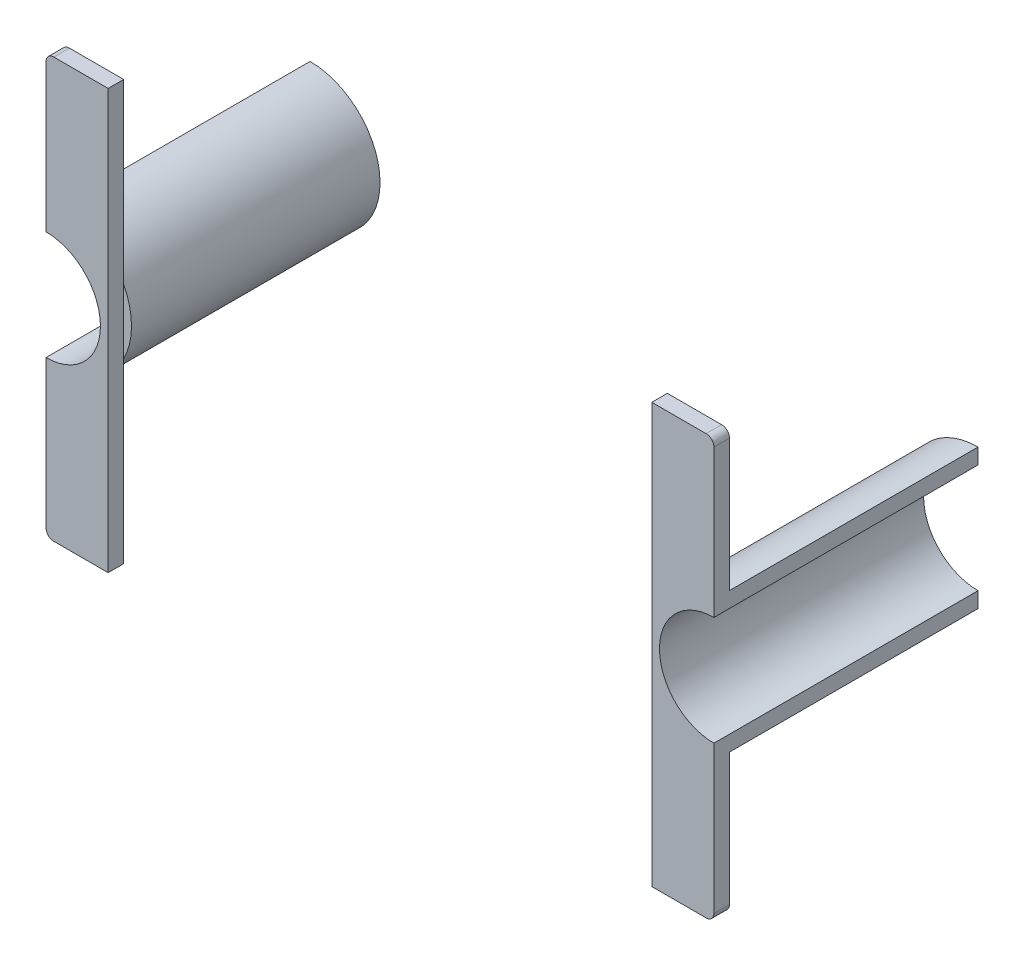
ISO-10303-21;
HEADER;
FILE_DESCRIPTION(('STEP AP214'),'2;1');
FILE_NAME('part.step','',(''),(''),'','','');
FILE_SCHEMA(('AUTOMOTIVE_DESIGN { 1 0 10303 214 1 1 1 1 }'));
ENDSEC;
DATA;
#1=APPLICATION_CONTEXT('core data for automotive mechanical design processes');
#2=APPLICATION_PROTOCOL_DEFINITION('international standard','automotive_design',2000,#1);
#3=PRODUCT_CONTEXT('',#1,'mechanical');
#4=PRODUCT('Part','Part','',(#3));
#5=PRODUCT_RELATED_PRODUCT_CATEGORY('part','',(#4));
#6=PRODUCT_DEFINITION_FORMATION('','',#4);
#7=PRODUCT_DEFINITION_CONTEXT('part definition',#1,'design');
#8=PRODUCT_DEFINITION('design','',#6,#7);
#9=PRODUCT_DEFINITION_SHAPE('','',#8);
#10=(LENGTH_UNIT() NAMED_UNIT(*) SI_UNIT(.MILLI.,.METRE.));
#11=(NAMED_UNIT(*) PLANE_ANGLE_UNIT() SI_UNIT($,.RADIAN.));
#12=(NAMED_UNIT(*) SI_UNIT($,.STERADIAN.) SOLID_ANGLE_UNIT());
#13=UNCERTAINTY_MEASURE_WITH_UNIT(LENGTH_MEASURE(1.E-05),#10,'distance_accuracy_value','');
#14=(GEOMETRIC_REPRESENTATION_CONTEXT(3) GLOBAL_UNCERTAINTY_ASSIGNED_CONTEXT((#13)) GLOBAL_UNIT_ASSIGNED_CONTEXT((#10,
#11,#12)) REPRESENTATION_CONTEXT('',''));
#15=CARTESIAN_POINT('',(0.,0.,0.));
#16=DIRECTION('',(0.,0.,1.));
#17=DIRECTION('',(1.,0.,0.));
#18=AXIS2_PLACEMENT_3D('',#15,#16,#17);
#19=CARTESIAN_POINT('',(15.02499934,-15.00000057476,-1.611602067947));
#20=DIRECTION('',(0.,8.74227765734797E-08,-0.999999999999996));
#21=DIRECTION('',(0.,0.999999999999996,8.74227765734797E-08));
#22=AXIS2_PLACEMENT_3D('',#19,#20,#21);
#23=PLANE('',#22);
#24=DIRECTION('',(0.999999999999996,-8.7422776573479E-08,0.));
#25=VECTOR('',#24,1.);
#26=CARTESIAN_POINT('',(15.12499928099,-15.6750005835,-1.611602126958));
#27=LINE('',#26,#25);
#28=CARTESIAN_POINT('',(15.1249992809893,-15.6750005835,-1.61160204827733));
#29=VERTEX_POINT('',#28);
#30=CARTESIAN_POINT('',(14.9499992809897,-15.6750005682005,-1.611602126958));
#31=VERTEX_POINT('',#30);
#32=EDGE_CURVE('P0_E90',#29,#31,#27,.F.);
#33=ORIENTED_EDGE('',*,*,#32,.F.);
#34=DIRECTION('',(8.74227765734797E-08,0.999999999999996,0.));
#35=VECTOR('',#34,1.);
#36=CARTESIAN_POINT('',(15.12499939901,-14.3250005835,-1.611602008937));
#37=LINE('',#36,#35);
#38=CARTESIAN_POINT('',(15.12499939901,-14.3250005805882,-1.611602008937));
#39=VERTEX_POINT('',#38);
#40=EDGE_CURVE('P0_E123',#39,#29,#37,.F.);
#41=ORIENTED_EDGE('',*,*,#40,.F.);
#42=DIRECTION('',(0.999999999999996,-8.7422776573479E-08,0.));
#43=VECTOR('',#42,1.);
#44=CARTESIAN_POINT('',(14.92499939901,-14.32500056602,-1.611602008937));
#45=LINE('',#44,#43);
#46=CARTESIAN_POINT('',(14.9499993990103,-14.3250005682056,-1.61160200893722));
#47=VERTEX_POINT('',#46);
#48=EDGE_CURVE('P0_E120',#47,#39,#45,.T.);
#49=ORIENTED_EDGE('',*,*,#48,.F.);
#50=CARTESIAN_POINT('',(14.949999396825,-14.3500005682,-1.611602011123));
#51=DIRECTION('',(0.,8.74227765734797E-08,-0.999999999999996));
#52=DIRECTION('',(0.,0.999999999999996,8.74227765734797E-08));
#53=AXIS2_PLACEMENT_3D('',#50,#51,#52);
#54=CIRCLE('',#53,0.025);
#55=CARTESIAN_POINT('',(14.924999376072,-14.35000056711,-1.611602011123));
#56=VERTEX_POINT('',#55);
#57=EDGE_CURVE('P0_E156',#56,#47,#54,.T.);
#58=ORIENTED_EDGE('',*,*,#57,.F.);
#59=DIRECTION('',(0.,0.999999999999996,8.74227765734797E-08));
#60=VECTOR('',#59,1.);
#61=CARTESIAN_POINT('',(14.924999355319,-15.00000057476,-1.611602067947));
#62=LINE('',#61,#60);
#63=CARTESIAN_POINT('',(14.924999355319,-14.8247702020355,-1.61160205262794));
#64=VERTEX_POINT('',#63);
#65=EDGE_CURVE('P0_E102',#64,#56,#62,.T.);
#66=ORIENTED_EDGE('',*,*,#65,.F.);
#67=CARTESIAN_POINT('',(14.92499934,-15.00000056602,-1.61160206794712));
#68=DIRECTION('',(0.,8.74227765734797E-08,-0.999999999999996));
#69=DIRECTION('',(0.,0.999999999999996,8.74227765734797E-08));
#70=AXIS2_PLACEMENT_3D('',#67,#68,#69);
#71=CIRCLE('',#70,0.175230326829);
#72=CARTESIAN_POINT('',(14.9249993039281,-15.1752308928495,-1.61160208326624));
#73=VERTEX_POINT('',#72);
#74=EDGE_CURVE('P0_E110',#64,#73,#71,.T.);
#75=ORIENTED_EDGE('',*,*,#74,.T.);
#76=DIRECTION('',(0.,0.999999999999996,8.74227765734797E-08));
#77=VECTOR('',#76,1.);
#78=CARTESIAN_POINT('',(14.924999283175,-15.00000057476,-1.611602067947));
#79=LINE('',#78,#77);
#80=CARTESIAN_POINT('',(14.9249992831751,-15.65000056492,-1.61160212477212));
#81=VERTEX_POINT('',#80);
#82=EDGE_CURVE('P0_E107',#81,#73,#79,.T.);
#83=ORIENTED_EDGE('',*,*,#82,.F.);
#84=CARTESIAN_POINT('',(14.949999283175,-15.6500005682,-1.61160212477243));
#85=DIRECTION('',(0.,8.74227765734797E-08,-0.999999999999996));
#86=DIRECTION('',(0.,0.999999999999996,8.74227765734797E-08));
#87=AXIS2_PLACEMENT_3D('',#84,#85,#86);
#88=CIRCLE('',#87,0.025);
#89=EDGE_CURVE('P0_E20',#31,#81,#88,.T.);
#90=ORIENTED_EDGE('',*,*,#89,.F.);
#91=EDGE_LOOP('',(#33,#41,#49,#58,#66,#75,#83,#90));
#92=FACE_BOUND('',#91,.T.);
#93=ADVANCED_FACE('P0_F17',(#92),#23,.F.);
#94=CARTESIAN_POINT('',(15.12499928099,-15.6750005835,-1.611602126958));
#95=DIRECTION('',(-8.74227765734793E-08,-0.999999999999992,-8.74227765734793E-08));
#96=DIRECTION('',(0.,8.74227765734797E-08,-0.999999999999996));
#97=AXIS2_PLACEMENT_3D('',#94,#95,#96);
#98=PLANE('',#97);
#99=DIRECTION('',(0.,0.,1.));
#100=VECTOR('',#99,1.);
#101=CARTESIAN_POINT('',(15.1249992809893,-15.6750005835,-1.611602008937));
#102=LINE('',#101,#100);
#103=CARTESIAN_POINT('',(15.1249993142931,-15.6750005805867,-1.66160212695758));
#104=VERTEX_POINT('',#103);
#105=EDGE_CURVE('P0_E98',#29,#104,#102,.F.);
#106=ORIENTED_EDGE('',*,*,#105,.F.);
#107=ORIENTED_EDGE('',*,*,#32,.T.);
#108=DIRECTION('',(0.,8.74227765734797E-08,-0.999999999999996));
#109=VECTOR('',#108,1.);
#110=CARTESIAN_POINT('',(14.94999928099,-15.6750005682,-1.61160212695757));
#111=LINE('',#110,#109);
#112=CARTESIAN_POINT('',(14.9499992820825,-15.6750005714794,-1.66160212695757));
#113=VERTEX_POINT('',#112);
#114=EDGE_CURVE('P0_E95',#113,#31,#111,.F.);
#115=ORIENTED_EDGE('',*,*,#114,.F.);
#116=DIRECTION('',(1.,0.,0.));
#117=VECTOR('',#116,1.);
#118=CARTESIAN_POINT('',(15.02499934,-15.67500057913,-1.66160212695738));
#119=LINE('',#118,#117);
#120=EDGE_CURVE('P0_E172',#104,#113,#119,.F.);
#121=ORIENTED_EDGE('',*,*,#120,.F.);
#122=EDGE_LOOP('',(#106,#107,#115,#121));
#123=FACE_BOUND('',#122,.T.);
#124=ADVANCED_FACE('P0_F92',(#123),#98,.T.);
#125=CARTESIAN_POINT('',(14.949999283175,-15.6500005682,-1.611602124772));
#126=DIRECTION('',(0.,8.74227765734797E-08,-0.999999999999996));
#127=DIRECTION('',(0.,0.999999999999996,8.74227765734797E-08));
#128=AXIS2_PLACEMENT_3D('',#125,#126,#127);
#129=CYLINDRICAL_SURFACE('',#128,0.025);
#130=ORIENTED_EDGE('',*,*,#89,.T.);
#131=DIRECTION('',(0.,0.,1.));
#132=VECTOR('',#131,1.);
#133=CARTESIAN_POINT('',(14.9249992831756,-15.65000056164,-1.611602126958));
#134=LINE('',#133,#132);
#135=CARTESIAN_POINT('',(14.9249992831756,-15.6500005616416,-1.661602106205));
#136=VERTEX_POINT('',#135);
#137=EDGE_CURVE('P0_E168',#136,#81,#134,.T.);
#138=ORIENTED_EDGE('',*,*,#137,.F.);
#139=CARTESIAN_POINT('',(14.949999283175,-15.6500005638289,-1.661602124772));
#140=DIRECTION('',(0.,8.74227765734797E-08,-0.999999999999996));
#141=DIRECTION('',(0.,0.999999999999996,8.74227765734797E-08));
#142=AXIS2_PLACEMENT_3D('',#139,#140,#141);
#143=CIRCLE('',#142,0.025);
#144=EDGE_CURVE('P0_E113',#113,#136,#143,.T.);
#145=ORIENTED_EDGE('',*,*,#144,.F.);
#146=ORIENTED_EDGE('',*,*,#114,.T.);
#147=EDGE_LOOP('',(#130,#138,#145,#146));
#148=FACE_BOUND('',#147,.T.);
#149=ADVANCED_FACE('P0_F111',(#148),#129,.T.);
#150=CARTESIAN_POINT('',(14.92499934,-15.00000056602,-1.611602067947));
#151=DIRECTION('',(0.,8.74227765734797E-08,-0.999999999999996));
#152=DIRECTION('',(0.,0.999999999999996,8.74227765734797E-08));
#153=AXIS2_PLACEMENT_3D('',#150,#151,#152);
#154=CYLINDRICAL_SURFACE('',#153,0.175230326829);
#155=DIRECTION('',(0.,0.,1.));
#156=VECTOR('',#155,1.);
#157=CARTESIAN_POINT('',(14.924999355319,-14.82477016488,-1.611602052628));
#158=LINE('',#157,#156);
#159=CARTESIAN_POINT('',(14.924999355319,-14.8247701648808,-2.46160205044238));
#160=VERTEX_POINT('',#159);
#161=EDGE_CURVE('P0_E148',#160,#64,#158,.T.);
#162=ORIENTED_EDGE('',*,*,#161,.F.);
#163=CARTESIAN_POINT('',(14.92499934,-15.0000004917106,-2.46160206794688));
#164=DIRECTION('',(0.,8.74227765734797E-08,-0.999999999999996));
#165=DIRECTION('',(0.,0.999999999999996,8.74227765734797E-08));
#166=AXIS2_PLACEMENT_3D('',#163,#164,#165);
#167=CIRCLE('',#166,0.175230326829);
#168=CARTESIAN_POINT('',(14.9249993246811,-15.1752308556948,-2.461602083266));
#169=VERTEX_POINT('',#168);
#170=EDGE_CURVE('P0_E149',#160,#169,#167,.T.);
#171=ORIENTED_EDGE('',*,*,#170,.T.);
#172=DIRECTION('',(0.,0.,1.));
#173=VECTOR('',#172,1.);
#174=CARTESIAN_POINT('',(14.9249993246813,-15.17523089285,-1.611602126958));
#175=LINE('',#174,#173);
#176=EDGE_CURVE('P0_E164',#73,#169,#175,.F.);
#177=ORIENTED_EDGE('',*,*,#176,.F.);
#178=ORIENTED_EDGE('',*,*,#74,.F.);
#179=EDGE_LOOP('',(#162,#171,#177,#178));
#180=FACE_BOUND('',#179,.T.);
#181=ADVANCED_FACE('P0_F165',(#180),#154,.F.);
#182=CARTESIAN_POINT('',(14.949999396825,-14.3500005682,-1.611602011123));
#183=DIRECTION('',(0.,8.74227765734797E-08,-0.999999999999996));
#184=DIRECTION('',(0.,0.999999999999996,8.74227765734797E-08));
#185=AXIS2_PLACEMENT_3D('',#182,#183,#184);
#186=CYLINDRICAL_SURFACE('',#185,0.025);
#187=ORIENTED_EDGE('',*,*,#57,.T.);
#188=DIRECTION('',(0.,-8.74227765734797E-08,0.999999999999996));
#189=VECTOR('',#188,1.);
#190=CARTESIAN_POINT('',(14.94999939901,-14.3250005682056,-1.611602008937));
#191=LINE('',#190,#189);
#192=CARTESIAN_POINT('',(14.9499993979175,-14.3250005638322,-1.661602008937));
#193=VERTEX_POINT('',#192);
#194=EDGE_CURVE('P0_E124',#193,#47,#191,.T.);
#195=ORIENTED_EDGE('',*,*,#194,.F.);
#196=CARTESIAN_POINT('',(14.949999396825,-14.3500005638289,-1.66160201112257));
#197=DIRECTION('',(0.,8.74227765734797E-08,-0.999999999999996));
#198=DIRECTION('',(0.,0.999999999999996,8.74227765734797E-08));
#199=AXIS2_PLACEMENT_3D('',#196,#197,#198);
#200=CIRCLE('',#199,0.025);
#201=CARTESIAN_POINT('',(14.9249993782575,-14.3500005627344,-1.66160201112257));
#202=VERTEX_POINT('',#201);
#203=EDGE_CURVE('P0_E144',#202,#193,#200,.T.);
#204=ORIENTED_EDGE('',*,*,#203,.F.);
#205=DIRECTION('',(0.,0.,1.));
#206=VECTOR('',#205,1.);
#207=CARTESIAN_POINT('',(14.9249993968247,-14.35000056602,-1.611602052628));
#208=LINE('',#207,#206);
#209=EDGE_CURVE('P0_E181',#56,#202,#208,.F.);
#210=ORIENTED_EDGE('',*,*,#209,.F.);
#211=EDGE_LOOP('',(#187,#195,#204,#210));
#212=FACE_BOUND('',#211,.T.);
#213=ADVANCED_FACE('P0_F191',(#212),#186,.T.);
#214=CARTESIAN_POINT('',(14.92499939901,-14.32500056602,-1.611602008937));
#215=DIRECTION('',(8.74227765734793E-08,0.999999999999992,8.74227765734793E-08));
#216=DIRECTION('',(0.,-8.74227765734797E-08,0.999999999999996));
#217=AXIS2_PLACEMENT_3D('',#214,#215,#216);
#218=PLANE('',#217);
#219=DIRECTION('',(0.,0.,1.));
#220=VECTOR('',#219,1.);
#221=CARTESIAN_POINT('',(15.12499939901,-14.32500057913,-1.611602008937));
#222=LINE('',#221,#220);
#223=CARTESIAN_POINT('',(15.12499939901,-14.32500056893,-1.66160200893663));
#224=VERTEX_POINT('',#223);
#225=EDGE_CURVE('P0_E155',#224,#39,#222,.T.);
#226=ORIENTED_EDGE('',*,*,#225,.F.);
#227=DIRECTION('',(1.,0.,0.));
#228=VECTOR('',#227,1.);
#229=CARTESIAN_POINT('',(15.02499934,-14.32500056383,-1.66160200893663));
#230=LINE('',#229,#228);
#231=EDGE_CURVE('P0_E147',#193,#224,#230,.T.);
#232=ORIENTED_EDGE('',*,*,#231,.F.);
#233=ORIENTED_EDGE('',*,*,#194,.T.);
#234=ORIENTED_EDGE('',*,*,#48,.T.);
#235=EDGE_LOOP('',(#226,#232,#233,#234));
#236=FACE_BOUND('',#235,.T.);
#237=ADVANCED_FACE('P0_F187',(#236),#218,.T.);
#238=CARTESIAN_POINT('',(15.12499939901,-14.3250005835,-1.611602008937));
#239=DIRECTION('',(0.999999999999996,-8.74227765734797E-08,0.));
#240=DIRECTION('',(8.74227765734797E-08,0.999999999999996,0.));
#241=AXIS2_PLACEMENT_3D('',#238,#239,#240);
#242=PLANE('',#241);
#243=DIRECTION('',(0.,0.999999999999996,8.74227765734797E-08));
#244=VECTOR('',#243,1.);
#245=CARTESIAN_POINT('',(15.12499939901,-15.00000057039,-1.661602067947));
#246=LINE('',#245,#244);
#247=CARTESIAN_POINT('',(15.1249993740325,-14.8964211886428,-1.66160205889203));
#248=VERTEX_POINT('',#247);
#249=EDGE_CURVE('P0_E198',#224,#248,#246,.F.);
#250=ORIENTED_EDGE('',*,*,#249,.F.);
#251=ORIENTED_EDGE('',*,*,#225,.T.);
#252=ORIENTED_EDGE('',*,*,#40,.T.);
#253=ORIENTED_EDGE('',*,*,#105,.T.);
#254=DIRECTION('',(0.,0.999999999999996,8.74227765734797E-08));
#255=VECTOR('',#254,1.);
#256=CARTESIAN_POINT('',(15.124999330945,-15.00000057039,-1.661602067947));
#257=LINE('',#256,#255);
#258=CARTESIAN_POINT('',(15.1249993399988,-15.1035800003524,-1.661602077003));
#259=VERTEX_POINT('',#258);
#260=EDGE_CURVE('P0_E154',#259,#104,#257,.F.);
#261=ORIENTED_EDGE('',*,*,#260,.F.);
#262=DIRECTION('',(0.,-0.999999999999996,-8.74227765734797E-08));
#263=VECTOR('',#262,1.);
#264=CARTESIAN_POINT('',(15.124999349055,-15.00000057149,-1.661602067947));
#265=LINE('',#264,#263);
#266=EDGE_CURVE('P0_E35',#248,#259,#265,.T.);
#267=ORIENTED_EDGE('',*,*,#266,.F.);
#268=EDGE_LOOP('',(#250,#251,#252,#253,#261,#267));
#269=FACE_BOUND('',#268,.T.);
#270=ADVANCED_FACE('P0_F195',(#269),#242,.T.);
#271=CARTESIAN_POINT('',(15.02499934,-15.00000057039,-1.661602067947));
#272=DIRECTION('',(0.,8.74227765734797E-08,-0.999999999999996));
#273=DIRECTION('',(0.,0.999999999999996,8.74227765734797E-08));
#274=AXIS2_PLACEMENT_3D('',#271,#272,#273);
#275=PLANE('',#274);
#276=ORIENTED_EDGE('',*,*,#260,.T.);
#277=ORIENTED_EDGE('',*,*,#120,.T.);
#278=ORIENTED_EDGE('',*,*,#144,.T.);
#279=DIRECTION('',(-8.74227765734797E-08,-0.999999999999996,0.));
#280=VECTOR('',#279,1.);
#281=CARTESIAN_POINT('',(14.92499928099,-15.67500056602,-1.661602087638));
#282=LINE('',#281,#280);
#283=CARTESIAN_POINT('',(14.9249993301551,-15.2252305632543,-1.66160208763803));
#284=VERTEX_POINT('',#283);
#285=EDGE_CURVE('P0_E152',#284,#136,#282,.T.);
#286=ORIENTED_EDGE('',*,*,#285,.F.);
#287=CARTESIAN_POINT('',(14.92499934,-15.00000056164,-1.6616020679478));
#288=DIRECTION('',(0.,-8.74227765734797E-08,0.999999999999996));
#289=DIRECTION('',(0.,-0.999999999999996,-8.74227765734797E-08));
#290=AXIS2_PLACEMENT_3D('',#287,#288,#289);
#291=CIRCLE('',#290,0.225230326829);
#292=EDGE_CURVE('P0_E141',#259,#284,#291,.F.);
#293=ORIENTED_EDGE('',*,*,#292,.F.);
#294=EDGE_LOOP('',(#276,#277,#278,#286,#293));
#295=FACE_BOUND('',#294,.T.);
#296=ADVANCED_FACE('P0_F227',(#295),#275,.T.);
#297=CARTESIAN_POINT('',(14.92499928099,-15.67500056602,-1.611602126958));
#298=DIRECTION('',(-0.999999999999996,8.74227765734797E-08,0.));
#299=DIRECTION('',(-8.74227765734797E-08,-0.999999999999996,0.));
#300=AXIS2_PLACEMENT_3D('',#297,#298,#299);
#301=PLANE('',#300);
#302=DIRECTION('',(0.,-8.74227765734797E-08,0.999999999999996));
#303=VECTOR('',#302,1.);
#304=CARTESIAN_POINT('',(14.92499934,-15.225230888469,-1.66160208763726));
#305=LINE('',#304,#303);
#306=CARTESIAN_POINT('',(14.9249993323405,-15.2252308185308,-2.461602087638));
#307=VERTEX_POINT('',#306);
#308=EDGE_CURVE('P0_E140',#284,#307,#305,.F.);
#309=ORIENTED_EDGE('',*,*,#308,.F.);
#310=ORIENTED_EDGE('',*,*,#285,.T.);
#311=ORIENTED_EDGE('',*,*,#137,.T.);
#312=ORIENTED_EDGE('',*,*,#82,.T.);
#313=ORIENTED_EDGE('',*,*,#176,.T.);
#314=DIRECTION('',(0.,-0.999999999999996,-8.74227765734797E-08));
#315=VECTOR('',#314,1.);
#316=CARTESIAN_POINT('',(14.924999324681,-15.00000050155,-2.461602067947));
#317=LINE('',#316,#315);
#318=EDGE_CURVE('P0_E151',#169,#307,#317,.T.);
#319=ORIENTED_EDGE('',*,*,#318,.T.);
#320=EDGE_LOOP('',(#309,#310,#311,#312,#313,#319));
#321=FACE_BOUND('',#320,.T.);
#322=ADVANCED_FACE('P0_F241',(#321),#301,.T.);
#323=CARTESIAN_POINT('',(15.037614503415,-15.00000050155,-2.461602067947));
#324=DIRECTION('',(0.,-8.74227765734797E-08,0.999999999999996));
#325=DIRECTION('',(0.,-0.999999999999996,-8.74227765734797E-08));
#326=AXIS2_PLACEMENT_3D('',#323,#324,#325);
#327=PLANE('',#326);
#328=ORIENTED_EDGE('',*,*,#170,.F.);
#329=DIRECTION('',(-8.74227765734797E-08,-0.999999999999996,0.));
#330=VECTOR('',#329,1.);
#331=CARTESIAN_POINT('',(14.924999355319,-14.82477023919,-2.461602048257));
#332=LINE('',#331,#330);
#333=CARTESIAN_POINT('',(14.9249993596901,-14.7747701648728,-2.46160204825724));
#334=VERTEX_POINT('',#333);
#335=EDGE_CURVE('P0_E214',#334,#160,#332,.T.);
#336=ORIENTED_EDGE('',*,*,#335,.F.);
#337=CARTESIAN_POINT('',(14.92499934,-15.0000004917018,-2.46160206794774));
#338=DIRECTION('',(0.,-8.74227765734797E-08,0.999999999999996));
#339=DIRECTION('',(0.,-0.999999999999996,-8.74227765734797E-08));
#340=AXIS2_PLACEMENT_3D('',#337,#338,#339);
#341=CIRCLE('',#340,0.225230326829);
#342=EDGE_CURVE('P0_E137',#307,#334,#341,.T.);
#343=ORIENTED_EDGE('',*,*,#342,.F.);
#344=ORIENTED_EDGE('',*,*,#318,.F.);
#345=EDGE_LOOP('',(#328,#336,#343,#344));
#346=FACE_BOUND('',#345,.T.);
#347=ADVANCED_FACE('P0_F240',(#346),#327,.F.);
#348=CARTESIAN_POINT('',(14.924999355319,-14.82477023919,-1.611602052628));
#349=DIRECTION('',(-0.999999999999996,8.74227765734797E-08,0.));
#350=DIRECTION('',(-8.74227765734797E-08,-0.999999999999996,0.));
#351=AXIS2_PLACEMENT_3D('',#348,#349,#350);
#352=PLANE('',#351);
#353=ORIENTED_EDGE('',*,*,#161,.T.);
#354=ORIENTED_EDGE('',*,*,#65,.T.);
#355=ORIENTED_EDGE('',*,*,#209,.T.);
#356=DIRECTION('',(0.,0.999999999999996,8.74227765734797E-08));
#357=VECTOR('',#356,1.);
#358=CARTESIAN_POINT('',(14.92499935969,-15.00000057039,-1.661602067947));
#359=LINE('',#358,#357);
#360=CARTESIAN_POINT('',(14.92499935969,-14.774770234811,-1.66160204825687));
#361=VERTEX_POINT('',#360);
#362=EDGE_CURVE('P0_E202',#361,#202,#359,.T.);
#363=ORIENTED_EDGE('',*,*,#362,.F.);
#364=DIRECTION('',(0.,-8.74227765734797E-08,0.999999999999996));
#365=VECTOR('',#364,1.);
#366=CARTESIAN_POINT('',(14.92499935969,-14.774770234811,-1.66160204825674));
#367=LINE('',#366,#365);
#368=EDGE_CURVE('P0_E136',#334,#361,#367,.T.);
#369=ORIENTED_EDGE('',*,*,#368,.F.);
#370=ORIENTED_EDGE('',*,*,#335,.T.);
#371=EDGE_LOOP('',(#353,#354,#355,#363,#369,#370));
#372=FACE_BOUND('',#371,.T.);
#373=ADVANCED_FACE('P0_F237',(#372),#352,.T.);
#374=CARTESIAN_POINT('',(15.02499934,-15.00000057039,-1.661602067947));
#375=DIRECTION('',(0.,8.74227765734797E-08,-0.999999999999996));
#376=DIRECTION('',(0.,0.999999999999996,8.74227765734797E-08));
#377=AXIS2_PLACEMENT_3D('',#374,#375,#376);
#378=PLANE('',#377);
#379=CARTESIAN_POINT('',(14.92499934,-15.00000056164,-1.66160206794726));
#380=DIRECTION('',(0.,-8.74227765734797E-08,0.999999999999996));
#381=DIRECTION('',(0.,-0.999999999999996,-8.74227765734797E-08));
#382=AXIS2_PLACEMENT_3D('',#379,#380,#381);
#383=CIRCLE('',#382,0.225230326829);
#384=EDGE_CURVE('P0_E26',#361,#248,#383,.F.);
#385=ORIENTED_EDGE('',*,*,#384,.F.);
#386=ORIENTED_EDGE('',*,*,#362,.T.);
#387=ORIENTED_EDGE('',*,*,#203,.T.);
#388=ORIENTED_EDGE('',*,*,#231,.T.);
#389=ORIENTED_EDGE('',*,*,#249,.T.);
#390=EDGE_LOOP('',(#385,#386,#387,#388,#389));
#391=FACE_BOUND('',#390,.T.);
#392=ADVANCED_FACE('P0_F204',(#391),#378,.T.);
#393=CARTESIAN_POINT('',(15.037614503415,-15.00000057149,-1.661602067947));
#394=DIRECTION('',(0.,-8.74227765734797E-08,0.999999999999996));
#395=DIRECTION('',(0.,-0.999999999999996,-8.74227765734797E-08));
#396=AXIS2_PLACEMENT_3D('',#393,#394,#395);
#397=PLANE('',#396);
#398=ORIENTED_EDGE('',*,*,#266,.T.);
#399=CARTESIAN_POINT('',(14.92499934,-15.00000056164,-1.6616020679472));
#400=DIRECTION('',(0.,-8.74227765734797E-08,0.999999999999996));
#401=DIRECTION('',(0.,-0.999999999999996,-8.74227765734797E-08));
#402=AXIS2_PLACEMENT_3D('',#399,#400,#401);
#403=CIRCLE('',#402,0.225230326829);
#404=EDGE_CURVE('P0_E11',#248,#259,#403,.F.);
#405=ORIENTED_EDGE('',*,*,#404,.F.);
#406=EDGE_LOOP('',(#398,#405));
#407=FACE_BOUND('',#406,.T.);
#408=ADVANCED_FACE('P0_F231',(#407),#397,.T.);
#409=CARTESIAN_POINT('',(14.92499934,-15.00000056164,-1.661602067947));
#410=DIRECTION('',(0.,-8.74227765734797E-08,0.999999999999996));
#411=DIRECTION('',(0.,-0.999999999999996,-8.74227765734797E-08));
#412=AXIS2_PLACEMENT_3D('',#409,#410,#411);
#413=CYLINDRICAL_SURFACE('',#412,0.225230326829);
#414=ORIENTED_EDGE('',*,*,#384,.T.);
#415=ORIENTED_EDGE('',*,*,#404,.T.);
#416=ORIENTED_EDGE('',*,*,#292,.T.);
#417=ORIENTED_EDGE('',*,*,#308,.T.);
#418=ORIENTED_EDGE('',*,*,#342,.T.);
#419=ORIENTED_EDGE('',*,*,#368,.T.);
#420=EDGE_LOOP('',(#414,#415,#416,#417,#418,#419));
#421=FACE_BOUND('',#420,.T.);
#422=ADVANCED_FACE('P0_F233',(#421),#413,.T.);
#423=CLOSED_SHELL('',(#93,#124,#149,#181,#213,#237,#270,#296,#322,#347,#373,#392,#408,#422));
#424=MANIFOLD_SOLID_BREP('P0_B1',#423);
#425=CARTESIAN_POINT('',(16.87499928099,-15.67500073649,-1.611602126958));
#426=DIRECTION('',(-0.999999999999996,8.74227765734797E-08,0.));
#427=DIRECTION('',(-8.74227765734797E-08,-0.999999999999996,0.));
#428=AXIS2_PLACEMENT_3D('',#425,#426,#427);
#429=PLANE('',#428);
#430=DIRECTION('',(-8.74227765734797E-08,-0.999999999999996,0.));
#431=VECTOR('',#430,1.);
#432=CARTESIAN_POINT('',(16.87499928099,-15.67500073649,-1.661602077003));
#433=LINE('',#432,#431);
#434=CARTESIAN_POINT('',(16.8749993309452,-15.1035801708281,-1.66160207700297));
#435=VERTEX_POINT('',#434);
#436=CARTESIAN_POINT('',(16.87499928099,-15.6750007372181,-1.66160211030592));
#437=VERTEX_POINT('',#436);
#438=EDGE_CURVE('P1_E174',#435,#437,#433,.T.);
#439=ORIENTED_EDGE('',*,*,#438,.T.);
#440=DIRECTION('',(0.,8.74227765734797E-08,-0.999999999999996));
#441=VECTOR('',#440,1.);
#442=CARTESIAN_POINT('',(16.87499928099,-15.6750007364854,-1.611602126958));
#443=LINE('',#442,#441);
#444=CARTESIAN_POINT('',(16.87499928099,-15.6750007466885,-1.61160212695758));
#445=VERTEX_POINT('',#444);
#446=EDGE_CURVE('P1_E119',#445,#437,#443,.T.);
#447=ORIENTED_EDGE('',*,*,#446,.F.);
#448=DIRECTION('',(0.,0.999999999999996,8.74227765734797E-08));
#449=VECTOR('',#448,1.);
#450=CARTESIAN_POINT('',(16.87499928099,-15.00000074523,-1.611602067947));
#451=LINE('',#450,#449);
#452=CARTESIAN_POINT('',(16.87499932033,-14.32500073649,-1.61160200893675));
#453=VERTEX_POINT('',#452);
#454=EDGE_CURVE('P1_E98',#445,#453,#451,.T.);
#455=ORIENTED_EDGE('',*,*,#454,.T.);
#456=DIRECTION('',(0.,-8.74227765734797E-08,0.999999999999996));
#457=VECTOR('',#456,1.);
#458=CARTESIAN_POINT('',(16.87499939901,-14.32500073649,-1.611602008937));
#459=LINE('',#458,#457);
#460=CARTESIAN_POINT('',(16.8749993823586,-14.3250007335763,-1.66160200893675));
#461=VERTEX_POINT('',#460);
#462=EDGE_CURVE('P1_E117',#461,#453,#459,.T.);
#463=ORIENTED_EDGE('',*,*,#462,.F.);
#464=DIRECTION('',(-8.74227765734797E-08,-0.999999999999996,0.));
#465=VECTOR('',#464,1.);
#466=CARTESIAN_POINT('',(16.87499928099,-15.67500073649,-1.661602008937));
#467=LINE('',#466,#465);
#468=CARTESIAN_POINT('',(16.8749993490556,-14.8964212934073,-1.6616020588923));
#469=VERTEX_POINT('',#468);
#470=EDGE_CURVE('P1_E107',#461,#469,#467,.T.);
#471=ORIENTED_EDGE('',*,*,#470,.T.);
#472=DIRECTION('',(-8.74227765734797E-08,-0.999999999999996,0.));
#473=VECTOR('',#472,1.);
#474=CARTESIAN_POINT('',(16.87499928099,-15.67500073649,-1.661602058892));
#475=LINE('',#474,#473);
#476=EDGE_CURVE('P1_E115',#469,#435,#475,.T.);
#477=ORIENTED_EDGE('',*,*,#476,.T.);
#478=EDGE_LOOP('',(#439,#447,#455,#463,#471,#477));
#479=FACE_BOUND('',#478,.T.);
#480=ADVANCED_FACE('P1_F17',(#479),#429,.T.);
#481=CARTESIAN_POINT('',(17.07499928099,-15.67500075397,-1.611602126958));
#482=DIRECTION('',(-8.74227765734793E-08,-0.999999999999992,-8.74227765734793E-08));
#483=DIRECTION('',(0.,8.74227765734797E-08,-0.999999999999996));
#484=AXIS2_PLACEMENT_3D('',#481,#482,#483);
#485=PLANE('',#484);
#486=ORIENTED_EDGE('',*,*,#446,.T.);
#487=DIRECTION('',(1.,0.,0.));
#488=VECTOR('',#487,1.);
#489=CARTESIAN_POINT('',(16.97499934,-15.67500074742,-1.66160212695737));
#490=LINE('',#489,#488);
#491=CARTESIAN_POINT('',(17.0499992820825,-15.6750007474194,-1.661602126958));
#492=VERTEX_POINT('',#491);
#493=EDGE_CURVE('P1_E129',#492,#437,#490,.F.);
#494=ORIENTED_EDGE('',*,*,#493,.F.);
#495=DIRECTION('',(0.,8.74227765734797E-08,-0.999999999999996));
#496=VECTOR('',#495,1.);
#497=CARTESIAN_POINT('',(17.04999928099,-15.67500075179,-1.61160212695757));
#498=LINE('',#497,#496);
#499=CARTESIAN_POINT('',(17.0499992820825,-15.67500075179,-1.61160212695747));
#500=VERTEX_POINT('',#499);
#501=EDGE_CURVE('P1_E152',#500,#492,#498,.T.);
#502=ORIENTED_EDGE('',*,*,#501,.F.);
#503=DIRECTION('',(1.,0.,0.));
#504=VECTOR('',#503,1.);
#505=CARTESIAN_POINT('',(16.97499934,-15.67500075179,-1.61160212695737));
#506=LINE('',#505,#504);
#507=EDGE_CURVE('P1_E149',#500,#445,#506,.F.);
#508=ORIENTED_EDGE('',*,*,#507,.T.);
#509=EDGE_LOOP('',(#486,#494,#502,#508));
#510=FACE_BOUND('',#509,.T.);
#511=ADVANCED_FACE('P1_F332',(#510),#485,.T.);
#512=CARTESIAN_POINT('',(16.87499939901,-14.32500073649,-1.611602008937));
#513=DIRECTION('',(8.74227765734793E-08,0.999999999999992,8.74227765734793E-08));
#514=DIRECTION('',(0.,-8.74227765734797E-08,0.999999999999996));
#515=AXIS2_PLACEMENT_3D('',#512,#513,#514);
#516=PLANE('',#515);
#517=ORIENTED_EDGE('',*,*,#462,.T.);
#518=DIRECTION('',(1.,0.,0.));
#519=VECTOR('',#518,1.);
#520=CARTESIAN_POINT('',(16.97499934,-14.32500073649,-1.61160200893662));
#521=LINE('',#520,#519);
#522=CARTESIAN_POINT('',(17.049999396825,-14.32500074414,-1.611602008937));
#523=VERTEX_POINT('',#522);
#524=EDGE_CURVE('P1_E90',#453,#523,#521,.T.);
#525=ORIENTED_EDGE('',*,*,#524,.T.);
#526=DIRECTION('',(0.,8.74227765734797E-08,-0.999999999999996));
#527=VECTOR('',#526,1.);
#528=CARTESIAN_POINT('',(17.049999396825,-14.32500075179,-1.61160200893743));
#529=LINE('',#528,#527);
#530=CARTESIAN_POINT('',(17.049999396825,-14.3250007397694,-1.66160200893743));
#531=VERTEX_POINT('',#530);
#532=EDGE_CURVE('P1_E118',#531,#523,#529,.F.);
#533=ORIENTED_EDGE('',*,*,#532,.F.);
#534=DIRECTION('',(1.,0.,0.));
#535=VECTOR('',#534,1.);
#536=CARTESIAN_POINT('',(16.97499934,-14.32500073212,-1.66160200893663));
#537=LINE('',#536,#535);
#538=EDGE_CURVE('P1_E111',#461,#531,#537,.T.);
#539=ORIENTED_EDGE('',*,*,#538,.F.);
#540=EDGE_LOOP('',(#517,#525,#533,#539));
#541=FACE_BOUND('',#540,.T.);
#542=ADVANCED_FACE('P1_F121',(#541),#516,.T.);
#543=CARTESIAN_POINT('',(17.049999396825,-14.35000075179,-1.611602011123));
#544=DIRECTION('',(0.,8.74227765734797E-08,-0.999999999999996));
#545=DIRECTION('',(0.,0.999999999999996,8.74227765734797E-08));
#546=AXIS2_PLACEMENT_3D('',#543,#544,#545);
#547=CYLINDRICAL_SURFACE('',#546,0.025);
#548=CARTESIAN_POINT('',(17.049999396825,-14.35000075179,-1.61160201112257));
#549=DIRECTION('',(0.,8.74227765734797E-08,-0.999999999999996));
#550=DIRECTION('',(0.,0.999999999999996,8.74227765734797E-08));
#551=AXIS2_PLACEMENT_3D('',#548,#549,#550);
#552=CIRCLE('',#551,0.025);
#553=CARTESIAN_POINT('',(17.0749993968244,-14.3500007517878,-1.61160201112278));
#554=VERTEX_POINT('',#553);
#555=EDGE_CURVE('P1_E20',#523,#554,#552,.T.);
#556=ORIENTED_EDGE('',*,*,#555,.T.);
#557=DIRECTION('',(0.,0.,1.));
#558=VECTOR('',#557,1.);
#559=CARTESIAN_POINT('',(17.0749993968244,-14.3500007496,-1.611602008937));
#560=LINE('',#559,#558);
#561=CARTESIAN_POINT('',(17.0749993968244,-14.3500007496022,-1.66160202969));
#562=VERTEX_POINT('',#561);
#563=EDGE_CURVE('P1_E123',#562,#554,#560,.T.);
#564=ORIENTED_EDGE('',*,*,#563,.F.);
#565=CARTESIAN_POINT('',(17.049999396825,-14.3500007474189,-1.661602011123));
#566=DIRECTION('',(0.,8.74227765734797E-08,-0.999999999999996));
#567=DIRECTION('',(0.,0.999999999999996,8.74227765734797E-08));
#568=AXIS2_PLACEMENT_3D('',#565,#566,#567);
#569=CIRCLE('',#568,0.025);
#570=EDGE_CURVE('P1_E124',#531,#562,#569,.T.);
#571=ORIENTED_EDGE('',*,*,#570,.F.);
#572=ORIENTED_EDGE('',*,*,#532,.T.);
#573=EDGE_LOOP('',(#556,#564,#571,#572));
#574=FACE_BOUND('',#573,.T.);
#575=ADVANCED_FACE('P1_F211',(#574),#547,.T.);
#576=CARTESIAN_POINT('',(17.049999283175,-15.65000075179,-1.611602124772));
#577=DIRECTION('',(0.,8.74227765734797E-08,-0.999999999999996));
#578=DIRECTION('',(0.,0.999999999999996,8.74227765734797E-08));
#579=AXIS2_PLACEMENT_3D('',#576,#577,#578);
#580=CYLINDRICAL_SURFACE('',#579,0.025);
#581=CARTESIAN_POINT('',(17.049999283175,-15.65000075179,-1.611602124772));
#582=DIRECTION('',(0.,8.74227765734797E-08,-0.999999999999996));
#583=DIRECTION('',(0.,0.999999999999996,8.74227765734797E-08));
#584=AXIS2_PLACEMENT_3D('',#581,#582,#583);
#585=CIRCLE('',#584,0.025);
#586=CARTESIAN_POINT('',(17.0749992831753,-15.6500007539728,-1.6116021040195));
#587=VERTEX_POINT('',#586);
#588=EDGE_CURVE('P1_E200',#587,#500,#585,.T.);
#589=ORIENTED_EDGE('',*,*,#588,.T.);
#590=ORIENTED_EDGE('',*,*,#501,.T.);
#591=CARTESIAN_POINT('',(17.049999283175,-15.6500007474189,-1.66160212477243));
#592=DIRECTION('',(0.,8.74227765734797E-08,-0.999999999999996));
#593=DIRECTION('',(0.,0.999999999999996,8.74227765734797E-08));
#594=AXIS2_PLACEMENT_3D('',#591,#592,#593);
#595=CIRCLE('',#594,0.025);
#596=CARTESIAN_POINT('',(17.0749992831752,-15.650000751785,-1.66160212477222));
#597=VERTEX_POINT('',#596);
#598=EDGE_CURVE('P1_E139',#597,#492,#595,.T.);
#599=ORIENTED_EDGE('',*,*,#598,.F.);
#600=DIRECTION('',(0.,0.,1.));
#601=VECTOR('',#600,1.);
#602=CARTESIAN_POINT('',(17.0749992831753,-15.65000075397,-1.611602083267));
#603=LINE('',#602,#601);
#604=EDGE_CURVE('P1_E145',#587,#597,#603,.F.);
#605=ORIENTED_EDGE('',*,*,#604,.F.);
#606=EDGE_LOOP('',(#589,#590,#599,#605));
#607=FACE_BOUND('',#606,.T.);
#608=ADVANCED_FACE('P1_F306',(#607),#580,.T.);
#609=CARTESIAN_POINT('',(17.07499934,-15.00000075397,-1.611602067947));
#610=DIRECTION('',(0.,8.74227765734797E-08,-0.999999999999996));
#611=DIRECTION('',(0.,0.999999999999996,8.74227765734797E-08));
#612=AXIS2_PLACEMENT_3D('',#609,#610,#611);
#613=CYLINDRICAL_SURFACE('',#612,0.175230326829);
#614=DIRECTION('',(0.,0.,1.));
#615=VECTOR('',#614,1.);
#616=CARTESIAN_POINT('',(17.074999324681,-15.17523100649,-1.611602083267));
#617=LINE('',#616,#615);
#618=CARTESIAN_POINT('',(17.074999324681,-15.1752310064898,-2.46160208545212));
#619=VERTEX_POINT('',#618);
#620=CARTESIAN_POINT('',(17.074999324681,-15.1752310431355,-1.611602083267));
#621=VERTEX_POINT('',#620);
#622=EDGE_CURVE('P1_E155',#619,#621,#617,.T.);
#623=ORIENTED_EDGE('',*,*,#622,.F.);
#624=CARTESIAN_POINT('',(17.07499934,-15.0000006796606,-2.46160206794712));
#625=DIRECTION('',(0.,8.74227765734797E-08,-0.999999999999996));
#626=DIRECTION('',(0.,0.999999999999996,8.74227765734797E-08));
#627=AXIS2_PLACEMENT_3D('',#624,#625,#626);
#628=CIRCLE('',#627,0.175230326829);
#629=CARTESIAN_POINT('',(17.0749993575044,-14.8247703899908,-2.461602052628));
#630=VERTEX_POINT('',#629);
#631=EDGE_CURVE('P1_E164',#630,#619,#628,.F.);
#632=ORIENTED_EDGE('',*,*,#631,.F.);
#633=DIRECTION('',(0.,0.,1.));
#634=VECTOR('',#633,1.);
#635=CARTESIAN_POINT('',(17.0749993553187,-14.82477042715,-1.611602008937));
#636=LINE('',#635,#634);
#637=CARTESIAN_POINT('',(17.0749993553187,-14.8247704271455,-1.61160203187588));
#638=VERTEX_POINT('',#637);
#639=EDGE_CURVE('P1_E165',#638,#630,#636,.F.);
#640=ORIENTED_EDGE('',*,*,#639,.F.);
#641=CARTESIAN_POINT('',(17.07499934,-15.00000075397,-1.61160206794788));
#642=DIRECTION('',(0.,8.74227765734797E-08,-0.999999999999996));
#643=DIRECTION('',(0.,0.999999999999996,8.74227765734797E-08));
#644=AXIS2_PLACEMENT_3D('',#641,#642,#643);
#645=CIRCLE('',#644,0.175230326829);
#646=EDGE_CURVE('P1_E202',#638,#621,#645,.F.);
#647=ORIENTED_EDGE('',*,*,#646,.T.);
#648=EDGE_LOOP('',(#623,#632,#640,#647));
#649=FACE_BOUND('',#648,.T.);
#650=ADVANCED_FACE('P1_F297',(#649),#613,.F.);
#651=CARTESIAN_POINT('',(16.97499934,-15.00000074523,-1.611602067947));
#652=DIRECTION('',(0.,8.74227765734797E-08,-0.999999999999996));
#653=DIRECTION('',(0.,0.999999999999996,8.74227765734797E-08));
#654=AXIS2_PLACEMENT_3D('',#651,#652,#653);
#655=PLANE('',#654);
#656=DIRECTION('',(8.74227765734797E-08,0.999999999999996,0.));
#657=VECTOR('',#656,1.);
#658=CARTESIAN_POINT('',(17.074999324681,-15.1752310808,-1.611602083267));
#659=LINE('',#658,#657);
#660=EDGE_CURVE('P1_E158',#621,#587,#659,.F.);
#661=ORIENTED_EDGE('',*,*,#660,.F.);
#662=ORIENTED_EDGE('',*,*,#646,.F.);
#663=DIRECTION('',(8.74227765734797E-08,0.999999999999996,0.));
#664=VECTOR('',#663,1.);
#665=CARTESIAN_POINT('',(17.07499939901,-14.32500075397,-1.611602011123));
#666=LINE('',#665,#664);
#667=EDGE_CURVE('P1_E127',#554,#638,#666,.F.);
#668=ORIENTED_EDGE('',*,*,#667,.F.);
#669=ORIENTED_EDGE('',*,*,#555,.F.);
#670=ORIENTED_EDGE('',*,*,#524,.F.);
#671=ORIENTED_EDGE('',*,*,#454,.F.);
#672=ORIENTED_EDGE('',*,*,#507,.F.);
#673=ORIENTED_EDGE('',*,*,#588,.F.);
#674=EDGE_LOOP('',(#661,#662,#668,#669,#670,#671,#672,#673));
#675=FACE_BOUND('',#674,.T.);
#676=ADVANCED_FACE('P1_F213',(#675),#655,.F.);
#677=CARTESIAN_POINT('',(16.97499934,-15.00000074086,-1.661602067947));
#678=DIRECTION('',(0.,8.74227765734797E-08,-0.999999999999996));
#679=DIRECTION('',(0.,0.999999999999996,8.74227765734797E-08));
#680=AXIS2_PLACEMENT_3D('',#677,#678,#679);
#681=PLANE('',#680);
#682=CARTESIAN_POINT('',(17.07499934,-15.0000007496,-1.66160206794774));
#683=DIRECTION('',(0.,8.74227765734797E-08,-0.999999999999996));
#684=DIRECTION('',(0.,0.999999999999996,8.74227765734797E-08));
#685=AXIS2_PLACEMENT_3D('',#682,#683,#684);
#686=CIRCLE('',#685,0.225230326829);
#687=CARTESIAN_POINT('',(17.0749993203099,-15.225231076429,-1.661602106205));
#688=VERTEX_POINT('',#687);
#689=EDGE_CURVE('P1_E161',#688,#435,#686,.T.);
#690=ORIENTED_EDGE('',*,*,#689,.F.);
#691=DIRECTION('',(8.74227765734797E-08,0.999999999999996,0.));
#692=VECTOR('',#691,1.);
#693=CARTESIAN_POINT('',(17.074999324681,-15.1752310808,-1.661602124772));
#694=LINE('',#693,#692);
#695=EDGE_CURVE('P1_E142',#597,#688,#694,.T.);
#696=ORIENTED_EDGE('',*,*,#695,.F.);
#697=ORIENTED_EDGE('',*,*,#598,.T.);
#698=ORIENTED_EDGE('',*,*,#493,.T.);
#699=ORIENTED_EDGE('',*,*,#438,.F.);
#700=EDGE_LOOP('',(#690,#696,#697,#698,#699));
#701=FACE_BOUND('',#700,.T.);
#702=ADVANCED_FACE('P1_F278',(#701),#681,.T.);
#703=CARTESIAN_POINT('',(16.962384176585,-15.00000073976,-1.661602067947));
#704=DIRECTION('',(0.,8.74227765734797E-08,-0.999999999999996));
#705=DIRECTION('',(0.,0.999999999999996,8.74227765734797E-08));
#706=AXIS2_PLACEMENT_3D('',#703,#704,#705);
#707=PLANE('',#706);
#708=CARTESIAN_POINT('',(17.07499934,-15.0000007496,-1.6616020679478));
#709=DIRECTION('',(0.,8.74227765734797E-08,-0.999999999999996));
#710=DIRECTION('',(0.,0.999999999999996,8.74227765734797E-08));
#711=AXIS2_PLACEMENT_3D('',#708,#709,#710);
#712=CIRCLE('',#711,0.225230326829);
#713=EDGE_CURVE('P1_E191',#435,#469,#712,.T.);
#714=ORIENTED_EDGE('',*,*,#713,.F.);
#715=ORIENTED_EDGE('',*,*,#476,.F.);
#716=EDGE_LOOP('',(#714,#715));
#717=FACE_BOUND('',#716,.T.);
#718=ADVANCED_FACE('P1_F269',(#717),#707,.F.);
#719=CARTESIAN_POINT('',(16.97499934,-15.00000074086,-1.661602067947));
#720=DIRECTION('',(0.,8.74227765734797E-08,-0.999999999999996));
#721=DIRECTION('',(0.,0.999999999999996,8.74227765734797E-08));
#722=AXIS2_PLACEMENT_3D('',#719,#720,#721);
#723=PLANE('',#722);
#724=ORIENTED_EDGE('',*,*,#470,.F.);
#725=ORIENTED_EDGE('',*,*,#538,.T.);
#726=ORIENTED_EDGE('',*,*,#570,.T.);
#727=DIRECTION('',(8.74227765734797E-08,0.999999999999996,0.));
#728=VECTOR('',#727,1.);
#729=CARTESIAN_POINT('',(17.07499939901,-14.32500075397,-1.661602048257));
#730=LINE('',#729,#728);
#731=CARTESIAN_POINT('',(17.0749993498449,-14.7747707479857,-1.66160204825697));
#732=VERTEX_POINT('',#731);
#733=EDGE_CURVE('P1_E133',#732,#562,#730,.T.);
#734=ORIENTED_EDGE('',*,*,#733,.F.);
#735=CARTESIAN_POINT('',(17.07499934,-15.0000007496,-1.6616020679472));
#736=DIRECTION('',(0.,8.74227765734797E-08,-0.999999999999996));
#737=DIRECTION('',(0.,0.999999999999996,8.74227765734797E-08));
#738=AXIS2_PLACEMENT_3D('',#735,#736,#737);
#739=CIRCLE('',#738,0.225230326829);
#740=EDGE_CURVE('P1_E113',#469,#732,#739,.T.);
#741=ORIENTED_EDGE('',*,*,#740,.F.);
#742=EDGE_LOOP('',(#724,#725,#726,#734,#741));
#743=FACE_BOUND('',#742,.T.);
#744=ADVANCED_FACE('P1_F108',(#743),#723,.T.);
#745=CARTESIAN_POINT('',(17.07499939901,-14.32500075397,-1.611602008937));
#746=DIRECTION('',(0.999999999999996,-8.74227765734797E-08,0.));
#747=DIRECTION('',(8.74227765734797E-08,0.999999999999996,0.));
#748=AXIS2_PLACEMENT_3D('',#745,#746,#747);
#749=PLANE('',#748);
#750=DIRECTION('',(0.,8.74227765734797E-08,-0.999999999999996));
#751=VECTOR('',#750,1.);
#752=CARTESIAN_POINT('',(17.07499934,-14.774770422771,-1.66160204825674));
#753=LINE('',#752,#751);
#754=CARTESIAN_POINT('',(17.074999349845,-14.7747703528328,-2.461602048257));
#755=VERTEX_POINT('',#754);
#756=EDGE_CURVE('P1_E189',#732,#755,#753,.T.);
#757=ORIENTED_EDGE('',*,*,#756,.F.);
#758=ORIENTED_EDGE('',*,*,#733,.T.);
#759=ORIENTED_EDGE('',*,*,#563,.T.);
#760=ORIENTED_EDGE('',*,*,#667,.T.);
#761=ORIENTED_EDGE('',*,*,#639,.T.);
#762=DIRECTION('',(0.,0.999999999999996,8.74227765734797E-08));
#763=VECTOR('',#762,1.);
#764=CARTESIAN_POINT('',(17.07499935969,-15.00000066982,-2.461602067947));
#765=LINE('',#764,#763);
#766=EDGE_CURVE('P1_E196',#755,#630,#765,.F.);
#767=ORIENTED_EDGE('',*,*,#766,.F.);
#768=EDGE_LOOP('',(#757,#758,#759,#760,#761,#767));
#769=FACE_BOUND('',#768,.T.);
#770=ADVANCED_FACE('P1_F217',(#769),#749,.T.);
#771=CARTESIAN_POINT('',(16.962384176585,-15.00000066982,-2.461602067947));
#772=DIRECTION('',(0.,8.74227765734797E-08,-0.999999999999996));
#773=DIRECTION('',(0.,0.999999999999996,8.74227765734797E-08));
#774=AXIS2_PLACEMENT_3D('',#771,#772,#773);
#775=PLANE('',#774);
#776=ORIENTED_EDGE('',*,*,#766,.T.);
#777=ORIENTED_EDGE('',*,*,#631,.T.);
#778=DIRECTION('',(8.74227765734797E-08,0.999999999999996,0.));
#779=VECTOR('',#778,1.);
#780=CARTESIAN_POINT('',(17.074999324681,-15.1752310808,-2.461602087638));
#781=LINE('',#780,#779);
#782=CARTESIAN_POINT('',(17.0749993203099,-15.2252310239756,-2.46160208763776));
#783=VERTEX_POINT('',#782);
#784=EDGE_CURVE('P1_E35',#783,#619,#781,.T.);
#785=ORIENTED_EDGE('',*,*,#784,.F.);
#786=CARTESIAN_POINT('',(17.07499934,-15.0000006796618,-2.46160206794726));
#787=DIRECTION('',(0.,8.74227765734797E-08,-0.999999999999996));
#788=DIRECTION('',(0.,0.999999999999996,8.74227765734797E-08));
#789=AXIS2_PLACEMENT_3D('',#786,#787,#788);
#790=CIRCLE('',#789,0.225230326829);
#791=EDGE_CURVE('P1_E26',#755,#783,#790,.F.);
#792=ORIENTED_EDGE('',*,*,#791,.F.);
#793=EDGE_LOOP('',(#776,#777,#785,#792));
#794=FACE_BOUND('',#793,.T.);
#795=ADVANCED_FACE('P1_F227',(#794),#775,.T.);
#796=CARTESIAN_POINT('',(17.074999324681,-15.1752310808,-1.611602083267));
#797=DIRECTION('',(0.999999999999996,-8.74227765734797E-08,0.));
#798=DIRECTION('',(8.74227765734797E-08,0.999999999999996,0.));
#799=AXIS2_PLACEMENT_3D('',#796,#797,#798);
#800=PLANE('',#799);
#801=ORIENTED_EDGE('',*,*,#622,.T.);
#802=ORIENTED_EDGE('',*,*,#660,.T.);
#803=ORIENTED_EDGE('',*,*,#604,.T.);
#804=ORIENTED_EDGE('',*,*,#695,.T.);
#805=DIRECTION('',(0.,8.74227765734797E-08,-0.999999999999996));
#806=VECTOR('',#805,1.);
#807=CARTESIAN_POINT('',(17.07499932031,-15.225231076429,-1.66160208763726));
#808=LINE('',#807,#806);
#809=EDGE_CURVE('P1_E11',#783,#688,#808,.F.);
#810=ORIENTED_EDGE('',*,*,#809,.F.);
#811=ORIENTED_EDGE('',*,*,#784,.T.);
#812=EDGE_LOOP('',(#801,#802,#803,#804,#810,#811));
#813=FACE_BOUND('',#812,.T.);
#814=ADVANCED_FACE('P1_F223',(#813),#800,.T.);
#815=CARTESIAN_POINT('',(17.07499934,-15.0000007496,-1.661602067947));
#816=DIRECTION('',(0.,8.74227765734797E-08,-0.999999999999996));
#817=DIRECTION('',(0.,0.999999999999996,8.74227765734797E-08));
#818=AXIS2_PLACEMENT_3D('',#815,#816,#817);
#819=CYLINDRICAL_SURFACE('',#818,0.225230326829);
#820=ORIENTED_EDGE('',*,*,#791,.T.);
#821=ORIENTED_EDGE('',*,*,#809,.T.);
#822=ORIENTED_EDGE('',*,*,#689,.T.);
#823=ORIENTED_EDGE('',*,*,#713,.T.);
#824=ORIENTED_EDGE('',*,*,#740,.T.);
#825=ORIENTED_EDGE('',*,*,#756,.T.);
#826=EDGE_LOOP('',(#820,#821,#822,#823,#824,#825));
#827=FACE_BOUND('',#826,.T.);
#828=ADVANCED_FACE('P1_F226',(#827),#819,.T.);
#829=CLOSED_SHELL('',(#480,#511,#542,#575,#608,#650,#676,#702,#718,#744,#770,#795,#814,#828));
#830=MANIFOLD_SOLID_BREP('P1_B1',#829);
#831=ADVANCED_BREP_SHAPE_REPRESENTATION('',(#18,#424,#830),#14);
#832=SHAPE_DEFINITION_REPRESENTATION(#9,#831);
ENDSEC;
END-ISO-10303-21;
